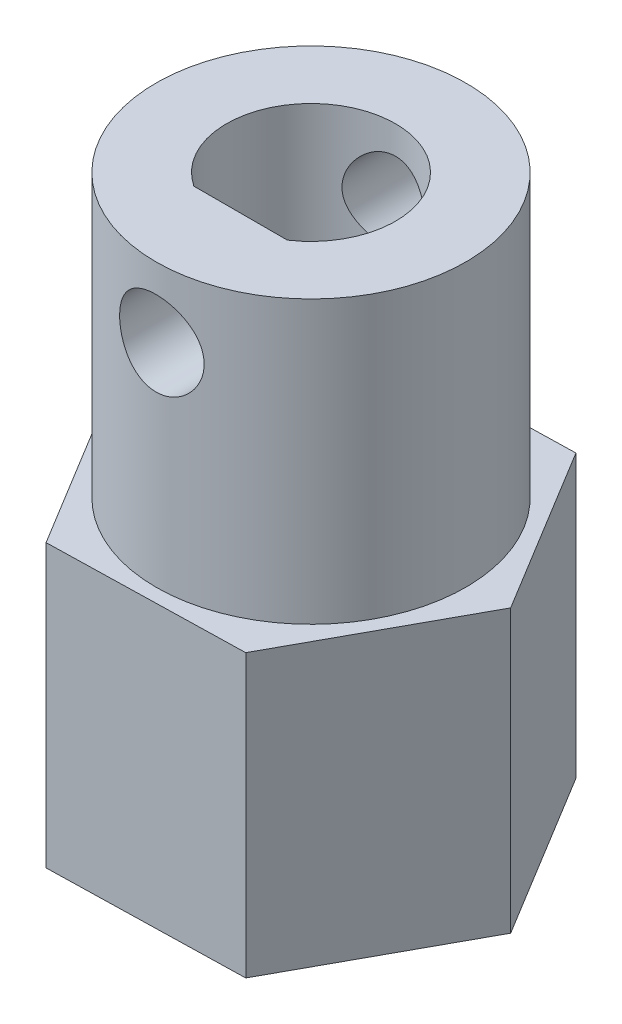
ISO-10303-21;
HEADER;
FILE_DESCRIPTION(('STEP AP214'),'2;1');
FILE_NAME('part.step','',(''),(''),'','','');
FILE_SCHEMA(('AUTOMOTIVE_DESIGN { 1 0 10303 214 1 1 1 1 }'));
ENDSEC;
DATA;
#1=APPLICATION_CONTEXT('core data for automotive mechanical design processes');
#2=APPLICATION_PROTOCOL_DEFINITION('international standard','automotive_design',2000,#1);
#3=PRODUCT_CONTEXT('',#1,'mechanical');
#4=PRODUCT('Part','Part','',(#3));
#5=PRODUCT_RELATED_PRODUCT_CATEGORY('part','',(#4));
#6=PRODUCT_DEFINITION_FORMATION('','',#4);
#7=PRODUCT_DEFINITION_CONTEXT('part definition',#1,'design');
#8=PRODUCT_DEFINITION('design','',#6,#7);
#9=PRODUCT_DEFINITION_SHAPE('','',#8);
#10=(LENGTH_UNIT() NAMED_UNIT(*) SI_UNIT(.MILLI.,.METRE.));
#11=(NAMED_UNIT(*) PLANE_ANGLE_UNIT() SI_UNIT($,.RADIAN.));
#12=(NAMED_UNIT(*) SI_UNIT($,.STERADIAN.) SOLID_ANGLE_UNIT());
#13=UNCERTAINTY_MEASURE_WITH_UNIT(LENGTH_MEASURE(1.E-05),#10,'distance_accuracy_value','');
#14=(GEOMETRIC_REPRESENTATION_CONTEXT(3) GLOBAL_UNCERTAINTY_ASSIGNED_CONTEXT((#13)) GLOBAL_UNIT_ASSIGNED_CONTEXT((#10,
#11,#12)) REPRESENTATION_CONTEXT('',''));
#15=CARTESIAN_POINT('',(0.,0.,0.));
#16=DIRECTION('',(0.,0.,1.));
#17=DIRECTION('',(1.,0.,0.));
#18=AXIS2_PLACEMENT_3D('',#15,#16,#17);
#19=CARTESIAN_POINT('',(-3.32404227515908,10.,6.07871227752681));
#20=DIRECTION('',(-0.0231879868246626,0.,-0.999731122485951));
#21=DIRECTION('',(-0.999731122485951,0.,0.0231879868246626));
#22=AXIS2_PLACEMENT_3D('',#19,#20,#21);
#23=PLANE('',#22);
#24=DIRECTION('',(0.999731122485951,0.,-0.0231879868246626));
#25=VECTOR('',#24,1.);
#26=CARTESIAN_POINT('',(-3.32404227515908,0.,6.07871227752681));
#27=LINE('',#26,#25);
#28=CARTESIAN_POINT('',(-3.32404227515908,0.,6.07871227752681));
#29=VERTEX_POINT('',#28);
#30=CARTESIAN_POINT('',(3.60229811705504,0.,5.9180611923046));
#31=VERTEX_POINT('',#30);
#32=EDGE_CURVE('E143',#29,#31,#27,.T.);
#33=ORIENTED_EDGE('',*,*,#32,.T.);
#34=DIRECTION('',(0.,-1.,0.));
#35=VECTOR('',#34,1.);
#36=CARTESIAN_POINT('',(3.60229811705504,10.,5.9180611923046));
#37=LINE('',#36,#35);
#38=CARTESIAN_POINT('',(3.60229811705504,10.,5.9180611923046));
#39=VERTEX_POINT('',#38);
#40=EDGE_CURVE('E52',#39,#31,#37,.T.);
#41=ORIENTED_EDGE('',*,*,#40,.F.);
#42=DIRECTION('',(0.999731122485951,0.,-0.0231879868246626));
#43=VECTOR('',#42,1.);
#44=CARTESIAN_POINT('',(-3.32404227515908,10.,6.07871227752681));
#45=LINE('',#44,#43);
#46=CARTESIAN_POINT('',(-3.32404227515908,10.,6.07871227752681));
#47=VERTEX_POINT('',#46);
#48=EDGE_CURVE('E155',#47,#39,#45,.T.);
#49=ORIENTED_EDGE('',*,*,#48,.F.);
#50=DIRECTION('',(0.,-1.,0.));
#51=VECTOR('',#50,1.);
#52=CARTESIAN_POINT('',(-3.32404227515908,10.,6.07871227752681));
#53=LINE('',#52,#51);
#54=EDGE_CURVE('E139',#47,#29,#53,.T.);
#55=ORIENTED_EDGE('',*,*,#54,.T.);
#56=EDGE_LOOP('',(#33,#41,#49,#55));
#57=FACE_BOUND('',#56,.T.);
#58=ADVANCED_FACE('F39',(#57),#23,.F.);
#59=CARTESIAN_POINT('',(3.60229811705504,10.,5.9180611923046));
#60=DIRECTION('',(-0.877386542439097,0.,-0.479784175590198));
#61=DIRECTION('',(-0.479784175590198,0.,0.877386542439097));
#62=AXIS2_PLACEMENT_3D('',#59,#60,#61);
#63=PLANE('',#62);
#64=DIRECTION('',(0.479784175590198,0.,-0.877386542439097));
#65=VECTOR('',#64,1.);
#66=CARTESIAN_POINT('',(3.60229811705504,0.,5.9180611923046));
#67=LINE('',#66,#65);
#68=CARTESIAN_POINT('',(6.92634039221413,0.,-0.160651085222219));
#69=VERTEX_POINT('',#68);
#70=EDGE_CURVE('E146',#31,#69,#67,.T.);
#71=ORIENTED_EDGE('',*,*,#70,.T.);
#72=DIRECTION('',(0.,-1.,0.));
#73=VECTOR('',#72,1.);
#74=CARTESIAN_POINT('',(6.92634039221413,10.,-0.160651085222219));
#75=LINE('',#74,#73);
#76=CARTESIAN_POINT('',(6.92634039221413,10.,-0.160651085222219));
#77=VERTEX_POINT('',#76);
#78=EDGE_CURVE('E159',#77,#69,#75,.T.);
#79=ORIENTED_EDGE('',*,*,#78,.F.);
#80=DIRECTION('',(0.479784175590198,0.,-0.877386542439097));
#81=VECTOR('',#80,1.);
#82=CARTESIAN_POINT('',(3.60229811705504,10.,5.9180611923046));
#83=LINE('',#82,#81);
#84=EDGE_CURVE('E105',#39,#77,#83,.T.);
#85=ORIENTED_EDGE('',*,*,#84,.F.);
#86=ORIENTED_EDGE('',*,*,#40,.T.);
#87=EDGE_LOOP('',(#71,#79,#85,#86));
#88=FACE_BOUND('',#87,.T.);
#89=ADVANCED_FACE('F162',(#88),#63,.F.);
#90=CARTESIAN_POINT('',(6.92634039221413,10.,-0.160651085222219));
#91=DIRECTION('',(-0.854198555614434,0.,0.519946946895753));
#92=DIRECTION('',(0.519946946895753,0.,0.854198555614434));
#93=AXIS2_PLACEMENT_3D('',#90,#91,#92);
#94=PLANE('',#93);
#95=DIRECTION('',(-0.519946946895753,0.,-0.854198555614434));
#96=VECTOR('',#95,1.);
#97=CARTESIAN_POINT('',(6.92634039221413,0.,-0.160651085222219));
#98=LINE('',#97,#96);
#99=CARTESIAN_POINT('',(3.32404227515908,0.,-6.07871227752682));
#100=VERTEX_POINT('',#99);
#101=EDGE_CURVE('E149',#69,#100,#98,.T.);
#102=ORIENTED_EDGE('',*,*,#101,.T.);
#103=DIRECTION('',(0.,-1.,0.));
#104=VECTOR('',#103,1.);
#105=CARTESIAN_POINT('',(3.32404227515908,10.,-6.07871227752682));
#106=LINE('',#105,#104);
#107=CARTESIAN_POINT('',(3.32404227515908,10.,-6.07871227752682));
#108=VERTEX_POINT('',#107);
#109=EDGE_CURVE('E134',#108,#100,#106,.T.);
#110=ORIENTED_EDGE('',*,*,#109,.F.);
#111=DIRECTION('',(-0.519946946895753,0.,-0.854198555614434));
#112=VECTOR('',#111,1.);
#113=CARTESIAN_POINT('',(6.92634039221413,10.,-0.160651085222219));
#114=LINE('',#113,#112);
#115=EDGE_CURVE('E122',#77,#108,#114,.T.);
#116=ORIENTED_EDGE('',*,*,#115,.F.);
#117=ORIENTED_EDGE('',*,*,#78,.T.);
#118=EDGE_LOOP('',(#102,#110,#116,#117));
#119=FACE_BOUND('',#118,.T.);
#120=ADVANCED_FACE('F170',(#119),#94,.F.);
#121=CARTESIAN_POINT('',(3.32404227515908,10.,-6.07871227752682));
#122=DIRECTION('',(0.023187986824663,0.,0.999731122485951));
#123=DIRECTION('',(0.999731122485951,0.,-0.023187986824663));
#124=AXIS2_PLACEMENT_3D('',#121,#122,#123);
#125=PLANE('',#124);
#126=DIRECTION('',(-0.999731122485951,0.,0.023187986824663));
#127=VECTOR('',#126,1.);
#128=CARTESIAN_POINT('',(3.32404227515908,0.,-6.07871227752682));
#129=LINE('',#128,#127);
#130=CARTESIAN_POINT('',(-3.60229811705503,0.,-5.9180611923046));
#131=VERTEX_POINT('',#130);
#132=EDGE_CURVE('E131',#100,#131,#129,.T.);
#133=ORIENTED_EDGE('',*,*,#132,.T.);
#134=DIRECTION('',(0.,-1.,0.));
#135=VECTOR('',#134,1.);
#136=CARTESIAN_POINT('',(-3.60229811705503,10.,-5.9180611923046));
#137=LINE('',#136,#135);
#138=CARTESIAN_POINT('',(-3.60229811705503,10.,-5.9180611923046));
#139=VERTEX_POINT('',#138);
#140=EDGE_CURVE('E128',#139,#131,#137,.T.);
#141=ORIENTED_EDGE('',*,*,#140,.F.);
#142=DIRECTION('',(-0.999731122485951,0.,0.023187986824663));
#143=VECTOR('',#142,1.);
#144=CARTESIAN_POINT('',(3.32404227515908,10.,-6.07871227752682));
#145=LINE('',#144,#143);
#146=EDGE_CURVE('E115',#108,#139,#145,.T.);
#147=ORIENTED_EDGE('',*,*,#146,.F.);
#148=ORIENTED_EDGE('',*,*,#109,.T.);
#149=EDGE_LOOP('',(#133,#141,#147,#148));
#150=FACE_BOUND('',#149,.T.);
#151=ADVANCED_FACE('F129',(#150),#125,.F.);
#152=CARTESIAN_POINT('',(-3.60229811705503,10.,-5.9180611923046));
#153=DIRECTION('',(0.877386542439097,0.,0.479784175590199));
#154=DIRECTION('',(0.479784175590199,0.,-0.877386542439097));
#155=AXIS2_PLACEMENT_3D('',#152,#153,#154);
#156=PLANE('',#155);
#157=DIRECTION('',(-0.479784175590199,0.,0.877386542439097));
#158=VECTOR('',#157,1.);
#159=CARTESIAN_POINT('',(-3.60229811705503,0.,-5.9180611923046));
#160=LINE('',#159,#158);
#161=CARTESIAN_POINT('',(-6.92634039221413,0.,0.160651085222216));
#162=VERTEX_POINT('',#161);
#163=EDGE_CURVE('E152',#131,#162,#160,.T.);
#164=ORIENTED_EDGE('',*,*,#163,.T.);
#165=DIRECTION('',(0.,-1.,0.));
#166=VECTOR('',#165,1.);
#167=CARTESIAN_POINT('',(-6.92634039221413,10.,0.160651085222216));
#168=LINE('',#167,#166);
#169=CARTESIAN_POINT('',(-6.92634039221413,10.,0.160651085222216));
#170=VERTEX_POINT('',#169);
#171=EDGE_CURVE('E135',#170,#162,#168,.T.);
#172=ORIENTED_EDGE('',*,*,#171,.F.);
#173=DIRECTION('',(-0.479784175590199,0.,0.877386542439097));
#174=VECTOR('',#173,1.);
#175=CARTESIAN_POINT('',(-3.60229811705503,10.,-5.9180611923046));
#176=LINE('',#175,#174);
#177=EDGE_CURVE('E119',#139,#170,#176,.T.);
#178=ORIENTED_EDGE('',*,*,#177,.F.);
#179=ORIENTED_EDGE('',*,*,#140,.T.);
#180=EDGE_LOOP('',(#164,#172,#178,#179));
#181=FACE_BOUND('',#180,.T.);
#182=ADVANCED_FACE('F137',(#181),#156,.F.);
#183=CARTESIAN_POINT('',(-6.92634039221413,10.,0.160651085222216));
#184=DIRECTION('',(0.854198555614434,0.,-0.519946946895753));
#185=DIRECTION('',(-0.519946946895753,0.,-0.854198555614434));
#186=AXIS2_PLACEMENT_3D('',#183,#184,#185);
#187=PLANE('',#186);
#188=DIRECTION('',(0.519946946895753,0.,0.854198555614434));
#189=VECTOR('',#188,1.);
#190=CARTESIAN_POINT('',(-6.92634039221413,0.,0.160651085222216));
#191=LINE('',#190,#189);
#192=EDGE_CURVE('E96',#162,#29,#191,.T.);
#193=ORIENTED_EDGE('',*,*,#192,.T.);
#194=ORIENTED_EDGE('',*,*,#54,.F.);
#195=DIRECTION('',(0.519946946895753,0.,0.854198555614434));
#196=VECTOR('',#195,1.);
#197=CARTESIAN_POINT('',(-6.92634039221413,10.,0.160651085222216));
#198=LINE('',#197,#196);
#199=EDGE_CURVE('E69',#170,#47,#198,.T.);
#200=ORIENTED_EDGE('',*,*,#199,.F.);
#201=ORIENTED_EDGE('',*,*,#171,.T.);
#202=EDGE_LOOP('',(#193,#194,#200,#201));
#203=FACE_BOUND('',#202,.T.);
#204=ADVANCED_FACE('F249',(#203),#187,.F.);
#205=CARTESIAN_POINT('',(0.,10.,0.));
#206=DIRECTION('',(0.,1.,0.));
#207=DIRECTION('',(0.,0.,1.));
#208=AXIS2_PLACEMENT_3D('',#205,#206,#207);
#209=PLANE('',#208);
#210=CARTESIAN_POINT('',(0.,10.,0.));
#211=DIRECTION('',(0.,1.,0.));
#212=DIRECTION('',(0.,0.,1.));
#213=AXIS2_PLACEMENT_3D('',#210,#211,#212);
#214=CIRCLE('',#213,5.5);
#215=CARTESIAN_POINT('',(0.,10.,5.5));
#216=VERTEX_POINT('',#215);
#217=EDGE_CURVE('E11',#216,#216,#214,.T.);
#218=ORIENTED_EDGE('',*,*,#217,.F.);
#219=EDGE_LOOP('',(#218));
#220=FACE_BOUND('',#219,.T.);
#221=ORIENTED_EDGE('',*,*,#48,.T.);
#222=ORIENTED_EDGE('',*,*,#84,.T.);
#223=ORIENTED_EDGE('',*,*,#115,.T.);
#224=ORIENTED_EDGE('',*,*,#146,.T.);
#225=ORIENTED_EDGE('',*,*,#177,.T.);
#226=ORIENTED_EDGE('',*,*,#199,.T.);
#227=EDGE_LOOP('',(#221,#222,#223,#224,#225,#226));
#228=FACE_BOUND('',#227,.T.);
#229=ADVANCED_FACE('F117',(#220,#228),#209,.T.);
#230=CARTESIAN_POINT('',(0.,0.,0.));
#231=DIRECTION('',(0.,1.,0.));
#232=DIRECTION('',(0.,0.,1.));
#233=AXIS2_PLACEMENT_3D('',#230,#231,#232);
#234=PLANE('',#233);
#235=CARTESIAN_POINT('',(0.,0.,0.));
#236=DIRECTION('',(0.,1.,0.));
#237=DIRECTION('',(0.,0.,1.));
#238=AXIS2_PLACEMENT_3D('',#235,#236,#237);
#239=CIRCLE('',#238,1.5);
#240=CARTESIAN_POINT('',(0.,0.,1.5));
#241=VERTEX_POINT('',#240);
#242=EDGE_CURVE('E357',#241,#241,#239,.T.);
#243=ORIENTED_EDGE('',*,*,#242,.T.);
#244=EDGE_LOOP('',(#243));
#245=FACE_BOUND('',#244,.T.);
#246=ORIENTED_EDGE('',*,*,#32,.F.);
#247=ORIENTED_EDGE('',*,*,#192,.F.);
#248=ORIENTED_EDGE('',*,*,#163,.F.);
#249=ORIENTED_EDGE('',*,*,#132,.F.);
#250=ORIENTED_EDGE('',*,*,#101,.F.);
#251=ORIENTED_EDGE('',*,*,#70,.F.);
#252=EDGE_LOOP('',(#246,#247,#248,#249,#250,#251));
#253=FACE_BOUND('',#252,.T.);
#254=ADVANCED_FACE('F167',(#245,#253),#234,.F.);
#255=CARTESIAN_POINT('',(0.,20.,0.));
#256=DIRECTION('',(0.,-1.,0.));
#257=DIRECTION('',(0.,0.,-1.));
#258=AXIS2_PLACEMENT_3D('',#255,#256,#257);
#259=CYLINDRICAL_SURFACE('',#258,5.5);
#260=CARTESIAN_POINT('',(0.,19.,-5.5));
#261=CARTESIAN_POINT('',(-0.0826209133321936,18.999998187389,-5.49999882717412));
#262=CARTESIAN_POINT('',(-0.165260978812708,18.9931509364166,-5.49812007260761));
#263=CARTESIAN_POINT('',(-0.328155930157698,18.9659941696968,-5.49080798085451));
#264=CARTESIAN_POINT('',(-0.408409727977265,18.9456786083714,-5.48537304740499));
#265=CARTESIAN_POINT('',(-0.564157626055395,18.8922982682616,-5.47154772174135));
#266=CARTESIAN_POINT('',(-0.639657866970163,18.8592503473381,-5.46316123869395));
#267=CARTESIAN_POINT('',(-0.78404449615972,18.7814070673376,-5.44431654412848));
#268=CARTESIAN_POINT('',(-0.852930363289778,18.7366107836461,-5.43385816956517));
#269=CARTESIAN_POINT('',(-0.983796947573262,18.6354001635327,-5.41171397042059));
#270=CARTESIAN_POINT('',(-1.04559512916994,18.5787545591458,-5.4000064149043));
#271=CARTESIAN_POINT('',(-1.15894293682478,18.4559473639701,-5.37682112935063));
#272=CARTESIAN_POINT('',(-1.21049117824722,18.3897844895977,-5.36534343055203));
#273=CARTESIAN_POINT('',(-1.30277794539498,18.2483487524205,-5.34369384163659));
#274=CARTESIAN_POINT('',(-1.34330426837587,18.1729328550637,-5.33354930058623));
#275=CARTESIAN_POINT('',(-1.41102916361228,18.0160361718006,-5.31603507411917));
#276=CARTESIAN_POINT('',(-1.43823031946844,17.9345565651115,-5.30866485085754));
#277=CARTESIAN_POINT('',(-1.47789456441268,17.7698721049875,-5.2977584719274));
#278=CARTESIAN_POINT('',(-1.49068960543229,17.6867530518381,-5.29413612283786));
#279=CARTESIAN_POINT('',(-1.50221364409134,17.5194753169912,-5.29087829084083));
#280=CARTESIAN_POINT('',(-1.50094540140883,17.4353168425,-5.2912420257326));
#281=CARTESIAN_POINT('',(-1.48464191780301,17.2709584490337,-5.29583824875456));
#282=CARTESIAN_POINT('',(-1.47001073668932,17.1907147653978,-5.29995718313671));
#283=CARTESIAN_POINT('',(-1.42804483871807,17.0338667139772,-5.31141755794059));
#284=CARTESIAN_POINT('',(-1.40070906504648,16.9572626495337,-5.31875926644153));
#285=CARTESIAN_POINT('',(-1.3337862982647,16.8088264794525,-5.33593618292326));
#286=CARTESIAN_POINT('',(-1.29405951882948,16.7370607989664,-5.34579959764141));
#287=CARTESIAN_POINT('',(-1.20357988022174,16.6010735525903,-5.36689368797792));
#288=CARTESIAN_POINT('',(-1.15282476106209,16.5368535371613,-5.37812464363249));
#289=CARTESIAN_POINT('',(-1.03967346682896,16.4154748101936,-5.40115894990605));
#290=CARTESIAN_POINT('',(-0.976938646167253,16.3586325507111,-5.41296874297114));
#291=CARTESIAN_POINT('',(-0.842682011788639,16.2562090350222,-5.43548647707978));
#292=CARTESIAN_POINT('',(-0.771159819718557,16.2106282639504,-5.44619437064292));
#293=CARTESIAN_POINT('',(-0.620853953739627,16.1318733272251,-5.46537278121261));
#294=CARTESIAN_POINT('',(-0.542037637417776,16.0987586614161,-5.47383251287305));
#295=CARTESIAN_POINT('',(-0.379672688714392,16.0463420274859,-5.48748356142612));
#296=CARTESIAN_POINT('',(-0.296125144317684,16.0270368975559,-5.49267562644564));
#297=CARTESIAN_POINT('',(-0.129368170483253,16.003289382203,-5.49909228776313));
#298=CARTESIAN_POINT('',(-0.0462242977839818,15.9984170046796,-5.50043163125371));
#299=CARTESIAN_POINT('',(0.119693365637971,16.0024827475134,-5.49932301585136));
#300=CARTESIAN_POINT('',(0.202467195532505,16.0114193696165,-5.49687546782998));
#301=CARTESIAN_POINT('',(0.363745097739554,16.0424975027031,-5.48854239265957));
#302=CARTESIAN_POINT('',(0.442299324272675,16.064397192757,-5.48271986472129));
#303=CARTESIAN_POINT('',(0.594609867448629,16.1204972446405,-5.46829923535645));
#304=CARTESIAN_POINT('',(0.668365651304994,16.1546989696613,-5.45970082634473));
#305=CARTESIAN_POINT('',(0.810641161194588,16.2352164422857,-5.44041573828275));
#306=CARTESIAN_POINT('',(0.879024602412582,16.2817634872615,-5.4296902954988));
#307=CARTESIAN_POINT('',(1.00716022013082,16.3853612875452,-5.40738988410035));
#308=CARTESIAN_POINT('',(1.06691060617763,16.4424142161575,-5.39581474001048));
#309=CARTESIAN_POINT('',(1.17791060344312,16.5674140380349,-5.37269401558495));
#310=CARTESIAN_POINT('',(1.22885627747222,16.635633382279,-5.36115944983886));
#311=CARTESIAN_POINT('',(1.3185858220796,16.7798986472193,-5.33980026187814));
#312=CARTESIAN_POINT('',(1.35737017925923,16.8559442546075,-5.32997557125461));
#313=CARTESIAN_POINT('',(1.42138558317209,17.013340628242,-5.31326248703816));
#314=CARTESIAN_POINT('',(1.44669352306985,17.0946582605252,-5.30635748202252));
#315=CARTESIAN_POINT('',(1.48320917220691,17.2606168380276,-5.29626814696188));
#316=CARTESIAN_POINT('',(1.49442068863148,17.3452568795537,-5.29308281231876));
#317=CARTESIAN_POINT('',(1.50219895576908,17.5123384038175,-5.29088009671763));
#318=CARTESIAN_POINT('',(1.49925533217026,17.5947555887225,-5.29172336001588));
#319=CARTESIAN_POINT('',(1.47994837643976,17.757870647735,-5.29715501736986));
#320=CARTESIAN_POINT('',(1.46358542028567,17.838568569947,-5.30174330649891));
#321=CARTESIAN_POINT('',(1.41819408435119,17.9953063157761,-5.31406316491799));
#322=CARTESIAN_POINT('',(1.38927395449127,18.0713797532418,-5.32176783125817));
#323=CARTESIAN_POINT('',(1.31967304541386,18.2176532768133,-5.33945189987964));
#324=CARTESIAN_POINT('',(1.27899034504456,18.2878524010652,-5.34943167369227));
#325=CARTESIAN_POINT('',(1.18555430984851,18.4227105976926,-5.37092379381814));
#326=CARTESIAN_POINT('',(1.13246901822125,18.4871337048431,-5.38247375845259));
#327=CARTESIAN_POINT('',(1.01636011199274,18.6063164067946,-5.40559990490855));
#328=CARTESIAN_POINT('',(0.953334059387993,18.6610736240053,-5.41717609247304));
#329=CARTESIAN_POINT('',(0.817407725686076,18.7605946145194,-5.43936459177359));
#330=CARTESIAN_POINT('',(0.744315866262517,18.805103480867,-5.44994907753807));
#331=CARTESIAN_POINT('',(0.591399899839277,18.8811324362115,-5.46865263780403));
#332=CARTESIAN_POINT('',(0.511579952421219,18.9126604805543,-5.47677322151197));
#333=CARTESIAN_POINT('',(0.36010010121821,18.957939509979,-5.48864193995757));
#334=CARTESIAN_POINT('',(0.289064640262467,18.9736745512417,-5.49286947681091));
#335=CARTESIAN_POINT('',(0.145357607941484,18.9947050253188,-5.49854887164354));
#336=CARTESIAN_POINT('',(0.0726862155649467,19.0000015946548,-5.5000010318002));
#337=CARTESIAN_POINT('',(0.,19.,-5.5));
#338=B_SPLINE_CURVE_WITH_KNOTS('',3,(#260,#261,#262,#263,#264,#265,#266,#267,#268,#269,#270,
#271,#272,#273,#274,#275,#276,#277,#278,#279,#280,#281,#282,#283,#284,#285,#286,#287,#288,#289,
#290,#291,#292,#293,#294,#295,#296,#297,#298,#299,#300,#301,#302,#303,#304,#305,#306,#307,#308,
#309,#310,#311,#312,#313,#314,#315,#316,#317,#318,#319,#320,#321,#322,#323,#324,#325,#326,#327,
#328,#329,#330,#331,#332,#333,#334,#335,#336,#337),.UNSPECIFIED.,.T.,.F.,(4,2,2,2,2,2,2,2,2,2,2,
2,2,2,2,2,2,2,2,2,2,2,2,2,2,2,2,2,2,2,2,2,2,2,2,2,2,2,4),(0.,0.247596106854897,0.4953034285513,
0.74268390242058,0.990083851364705,1.24285878223179,1.49566783659324,1.7530459365022,
2.01037411390997,2.26164304860926,2.51286267696538,2.75672886674887,3.00061534583717,
3.24735926767928,3.49415380139121,3.74938528550775,4.00462776284424,4.26107349736029,
4.51746049766944,4.76612811343083,5.01476875105251,5.25891111200195,5.50308053475837,
5.75219469009681,6.00136043656003,6.2579007306487,6.51443075867912,6.76948096455405,
7.02446227124211,7.27068852228629,7.51690787489588,7.76104555655818,8.00522313517587,
8.25689011392092,8.50861891104975,8.7660587228906,9.02334052607437,9.2411883209319,
9.45901239561305),.UNSPECIFIED.);
#339=CARTESIAN_POINT('',(0.,19.,-5.5));
#340=VERTEX_POINT('',#339);
#341=EDGE_CURVE('E186',#340,#340,#338,.T.);
#342=ORIENTED_EDGE('',*,*,#341,.T.);
#343=EDGE_LOOP('',(#342));
#344=FACE_BOUND('',#343,.T.);
#345=CARTESIAN_POINT('',(-1.5,17.5,5.29150262212918));
#346=CARTESIAN_POINT('',(-1.4999981569703,17.5825564510277,5.29150397933242));
#347=CARTESIAN_POINT('',(-1.49316121586719,17.6651321099555,5.29345578048323));
#348=CARTESIAN_POINT('',(-1.46604910592423,17.8278935253,5.3010274190552));
#349=CARTESIAN_POINT('',(-1.44576759691971,17.9080781354985,5.30664898703923));
#350=CARTESIAN_POINT('',(-1.39248674622751,18.0636791879618,5.32087717395131));
#351=CARTESIAN_POINT('',(-1.35950584697685,18.1391023609042,5.32947946238205));
#352=CARTESIAN_POINT('',(-1.2818207402325,18.2833581342367,5.34869425130277));
#353=CARTESIAN_POINT('',(-1.23711546969878,18.3521901362373,5.35930693404948));
#354=CARTESIAN_POINT('',(-1.13599985857016,18.4831102067913,5.38165786345274));
#355=CARTESIAN_POINT('',(-1.07933774218464,18.545000328378,5.39341679089298));
#356=CARTESIAN_POINT('',(-0.956458027204656,18.6585276577255,5.41655710292429));
#357=CARTESIAN_POINT('',(-0.890239400501259,18.710163760916,5.4279384467319));
#358=CARTESIAN_POINT('',(-0.748747592415017,18.8025486268105,5.44927272086847));
#359=CARTESIAN_POINT('',(-0.673340883118103,18.8430997218264,5.45919841481043));
#360=CARTESIAN_POINT('',(-0.516463712056495,18.9108728681829,5.4762652255866));
#361=CARTESIAN_POINT('',(-0.434994324603006,18.9380972745742,5.48340683437022));
#362=CARTESIAN_POINT('',(-0.270371451848028,18.9778010982805,5.49395456075485));
#363=CARTESIAN_POINT('',(-0.187304783419296,18.9906174442147,5.4974458959785));
#364=CARTESIAN_POINT('',(-0.0201318714747533,19.002202302298,5.50059802264474));
#365=CARTESIAN_POINT('',(0.063974187790725,19.0009732695445,5.50025948354));
#366=CARTESIAN_POINT('',(0.228490060702581,18.9847376013516,5.49585206403333));
#367=CARTESIAN_POINT('',(0.308938859429582,18.9700951266807,5.49188178563756));
#368=CARTESIAN_POINT('',(0.466191004896708,18.9280376676544,5.48077394096948));
#369=CARTESIAN_POINT('',(0.542994138822173,18.9006219386717,5.47363619004791));
#370=CARTESIAN_POINT('',(0.691693236894893,18.833522864157,5.45685088879515));
#371=CARTESIAN_POINT('',(0.763530775491581,18.7937165513123,5.44717834180867));
#372=CARTESIAN_POINT('',(0.899629268660998,18.7030611057326,5.4263628785745));
#373=CARTESIAN_POINT('',(0.963888684077532,18.6522097356287,5.41521966459727));
#374=CARTESIAN_POINT('',(1.08518074875882,18.5389820048791,5.39224620796906));
#375=CARTESIAN_POINT('',(1.14191553261874,18.4762883280592,5.38040539296798));
#376=CARTESIAN_POINT('',(1.24414076282169,18.3421547848867,5.35769198772825));
#377=CARTESIAN_POINT('',(1.28963045681795,18.2707143338136,5.34681946230361));
#378=CARTESIAN_POINT('',(1.36831504906637,18.1204456059996,5.32722971617593));
#379=CARTESIAN_POINT('',(1.40142544272701,18.0415709942258,5.31852743967169));
#380=CARTESIAN_POINT('',(1.45381649809065,17.8790773977709,5.30444735453973));
#381=CARTESIAN_POINT('',(1.47310077178258,17.7954596583672,5.29906867769277));
#382=CARTESIAN_POINT('',(1.49677126460125,17.62864781849,5.29243075183376));
#383=CARTESIAN_POINT('',(1.50160329063472,17.5455218132359,5.29104827888985));
#384=CARTESIAN_POINT('',(1.49746332611022,17.3796488564579,5.29222151202243));
#385=CARTESIAN_POINT('',(1.48849288189024,17.2969018635137,5.29477677694071));
#386=CARTESIAN_POINT('',(1.45739637961776,17.1358775626886,5.30341820279288));
#387=CARTESIAN_POINT('',(1.43554156609381,17.0575435793702,5.3094315020934));
#388=CARTESIAN_POINT('',(1.37960331838531,16.9056539900694,5.32423951436502));
#389=CARTESIAN_POINT('',(1.34551823366714,16.8320990306223,5.33303460273288));
#390=CARTESIAN_POINT('',(1.26519240779034,16.689999291833,5.3526656797527));
#391=CARTESIAN_POINT('',(1.21869167395158,16.621607425495,5.36354371589181));
#392=CARTESIAN_POINT('',(1.11517441622706,16.4934339346149,5.3860176273416));
#393=CARTESIAN_POINT('',(1.05815582137422,16.4336540098999,5.39761364372337));
#394=CARTESIAN_POINT('',(0.933153363001189,16.3225336360494,5.42064365021152));
#395=CARTESIAN_POINT('',(0.864888847519602,16.2715049965658,5.43206199790196));
#396=CARTESIAN_POINT('',(0.720505557506889,16.181629364909,5.45308956662174));
#397=CARTESIAN_POINT('',(0.6443872011088,16.1427817246722,5.46269888388575));
#398=CARTESIAN_POINT('',(0.486992338151914,16.0787329337421,5.47896373225224));
#399=CARTESIAN_POINT('',(0.405760013245428,16.0534291096995,5.48564141597945));
#400=CARTESIAN_POINT('',(0.239985864722823,16.0168930474549,5.49538823820121));
#401=CARTESIAN_POINT('',(0.155444815623821,16.0056575361731,5.4984582160406));
#402=CARTESIAN_POINT('',(-0.0116397196820183,15.9977898799094,5.50060207356917));
#403=CARTESIAN_POINT('',(-0.0941604093051871,16.0007013286933,5.49980084994582));
#404=CARTESIAN_POINT('',(-0.257491304637161,16.01997977731,5.4945768528746));
#405=CARTESIAN_POINT('',(-0.338301579771113,16.0363462299303,5.49015422670854));
#406=CARTESIAN_POINT('',(-0.495342033696845,16.0818073703395,5.47821112917835));
#407=CARTESIAN_POINT('',(-0.571602011794988,16.1108056982402,5.47071413494114));
#408=CARTESIAN_POINT('',(-0.718217369622532,16.1806216215351,5.45340440920124));
#409=CARTESIAN_POINT('',(-0.788571890732092,16.2214409318066,5.44359134174257));
#410=CARTESIAN_POINT('',(-0.92348867519543,16.3150547282817,5.42235787347661));
#411=CARTESIAN_POINT('',(-0.987837043212874,16.3681490724366,5.41090053751388));
#412=CARTESIAN_POINT('',(-1.10686496193089,16.4842421385502,5.38781343748961));
#413=CARTESIAN_POINT('',(-1.16154192474211,16.5472435029513,5.37618362817694));
#414=CARTESIAN_POINT('',(-1.2609396606189,16.6831275268309,5.35375507792812));
#415=CARTESIAN_POINT('',(-1.30539879787934,16.7562062026808,5.34298201162846));
#416=CARTESIAN_POINT('',(-1.38133806303029,16.9090859451496,5.32385655741428));
#417=CARTESIAN_POINT('',(-1.41282630671052,16.9888827705103,5.31550265682104));
#418=CARTESIAN_POINT('',(-1.45802611152119,17.1402680192526,5.30326481572331));
#419=CARTESIAN_POINT('',(-1.47372831222931,17.2112284687515,5.29889066810921));
#420=CARTESIAN_POINT('',(-1.494715407894,17.3547877979027,5.29300915582115));
#421=CARTESIAN_POINT('',(-1.5000016210592,17.4273864690513,5.29150142838456));
#422=CARTESIAN_POINT('',(-1.5,17.5,5.29150262212918));
#423=B_SPLINE_CURVE_WITH_KNOTS('',3,(#345,#346,#347,#348,#349,#350,#351,#352,#353,#354,#355,
#356,#357,#358,#359,#360,#361,#362,#363,#364,#365,#366,#367,#368,#369,#370,#371,#372,#373,#374,
#375,#376,#377,#378,#379,#380,#381,#382,#383,#384,#385,#386,#387,#388,#389,#390,#391,#392,#393,
#394,#395,#396,#397,#398,#399,#400,#401,#402,#403,#404,#405,#406,#407,#408,#409,#410,#411,#412,
#413,#414,#415,#416,#417,#418,#419,#420,#421,#422),.UNSPECIFIED.,.T.,.F.,(4,2,2,2,2,2,2,2,2,2,2,
2,2,2,2,2,2,2,2,2,2,2,2,2,2,2,2,2,2,2,2,2,2,2,2,2,2,2,4),(0.,0.247402201391969,0.49492115533674,
0.742082002291412,0.989265266888851,1.24229327000825,1.49534851471803,1.75265882819585,
2.00992365416646,2.26103843021061,2.51210931268384,2.75655962385663,3.0010241872433,
3.24799669713117,3.49501928234234,3.74996416866223,4.00492610732058,4.26159801830625,
4.51820285087414,4.76680611540842,5.01538153009581,5.25890187447337,5.50245509545498,
5.75157425489228,6.00074251835821,6.25748556676549,6.51421495339717,6.76896951768223,
7.02366480072505,7.27019876040454,7.51672269408902,7.76139812559489,8.00610907011738,
8.25758505394755,8.50912822664454,8.76653181226182,9.02377409687475,9.24140725781327,
9.45901287413893),.UNSPECIFIED.);
#424=CARTESIAN_POINT('',(-1.5,17.5,5.29150262212918));
#425=VERTEX_POINT('',#424);
#426=EDGE_CURVE('E197',#425,#425,#423,.T.);
#427=ORIENTED_EDGE('',*,*,#426,.T.);
#428=EDGE_LOOP('',(#427));
#429=FACE_BOUND('',#428,.T.);
#430=CARTESIAN_POINT('',(0.,20.,0.));
#431=DIRECTION('',(0.,1.,0.));
#432=DIRECTION('',(0.,0.,1.));
#433=AXIS2_PLACEMENT_3D('',#430,#431,#432);
#434=CIRCLE('',#433,5.5);
#435=CARTESIAN_POINT('',(0.,20.,5.5));
#436=VERTEX_POINT('',#435);
#437=EDGE_CURVE('E147',#436,#436,#434,.T.);
#438=ORIENTED_EDGE('',*,*,#437,.F.);
#439=EDGE_LOOP('',(#438));
#440=FACE_BOUND('',#439,.T.);
#441=ORIENTED_EDGE('',*,*,#217,.T.);
#442=EDGE_LOOP('',(#441));
#443=FACE_BOUND('',#442,.T.);
#444=ADVANCED_FACE('F202',(#344,#429,#440,#443),#259,.T.);
#445=CARTESIAN_POINT('',(0.,20.,0.));
#446=DIRECTION('',(0.,1.,0.));
#447=DIRECTION('',(0.,0.,1.));
#448=AXIS2_PLACEMENT_3D('',#445,#446,#447);
#449=PLANE('',#448);
#450=DIRECTION('',(1.,0.,0.));
#451=VECTOR('',#450,1.);
#452=CARTESIAN_POINT('',(0.,20.,2.5));
#453=LINE('',#452,#451);
#454=CARTESIAN_POINT('',(-1.6583123951777,20.,2.5));
#455=VERTEX_POINT('',#454);
#456=CARTESIAN_POINT('',(1.6583123951777,20.,2.5));
#457=VERTEX_POINT('',#456);
#458=EDGE_CURVE('E60',#455,#457,#453,.T.);
#459=ORIENTED_EDGE('',*,*,#458,.F.);
#460=CARTESIAN_POINT('',(0.,20.,0.));
#461=DIRECTION('',(0.,1.,0.));
#462=DIRECTION('',(0.,0.,1.));
#463=AXIS2_PLACEMENT_3D('',#460,#461,#462);
#464=CIRCLE('',#463,3.);
#465=EDGE_CURVE('E181',#457,#455,#464,.T.);
#466=ORIENTED_EDGE('',*,*,#465,.F.);
#467=EDGE_LOOP('',(#459,#466));
#468=FACE_BOUND('',#467,.T.);
#469=ORIENTED_EDGE('',*,*,#437,.T.);
#470=EDGE_LOOP('',(#469));
#471=FACE_BOUND('',#470,.T.);
#472=ADVANCED_FACE('F226',(#468,#471),#449,.T.);
#473=CARTESIAN_POINT('',(0.,8.5,2.5));
#474=DIRECTION('',(0.,0.,1.));
#475=DIRECTION('',(1.,0.,0.));
#476=AXIS2_PLACEMENT_3D('',#473,#474,#475);
#477=PLANE('',#476);
#478=CARTESIAN_POINT('',(0.,17.5,2.5));
#479=DIRECTION('',(0.,0.,1.));
#480=DIRECTION('',(1.,0.,0.));
#481=AXIS2_PLACEMENT_3D('',#478,#479,#480);
#482=CIRCLE('',#481,1.5);
#483=CARTESIAN_POINT('',(1.5,17.5,2.5));
#484=VERTEX_POINT('',#483);
#485=EDGE_CURVE('E363',#484,#484,#482,.T.);
#486=ORIENTED_EDGE('',*,*,#485,.T.);
#487=EDGE_LOOP('',(#486));
#488=FACE_BOUND('',#487,.T.);
#489=ORIENTED_EDGE('',*,*,#458,.T.);
#490=DIRECTION('',(0.,1.,0.));
#491=VECTOR('',#490,1.);
#492=CARTESIAN_POINT('',(1.6583123951777,8.5,2.5));
#493=LINE('',#492,#491);
#494=CARTESIAN_POINT('',(1.6583123951777,8.5,2.5));
#495=VERTEX_POINT('',#494);
#496=EDGE_CURVE('E177',#495,#457,#493,.T.);
#497=ORIENTED_EDGE('',*,*,#496,.F.);
#498=DIRECTION('',(1.,0.,0.));
#499=VECTOR('',#498,1.);
#500=CARTESIAN_POINT('',(0.,8.5,2.5));
#501=LINE('',#500,#499);
#502=CARTESIAN_POINT('',(-1.6583123951777,8.5,2.5));
#503=VERTEX_POINT('',#502);
#504=EDGE_CURVE('E184',#503,#495,#501,.T.);
#505=ORIENTED_EDGE('',*,*,#504,.F.);
#506=DIRECTION('',(0.,1.,0.));
#507=VECTOR('',#506,1.);
#508=CARTESIAN_POINT('',(-1.6583123951777,8.5,2.5));
#509=LINE('',#508,#507);
#510=EDGE_CURVE('E176',#503,#455,#509,.T.);
#511=ORIENTED_EDGE('',*,*,#510,.T.);
#512=EDGE_LOOP('',(#489,#497,#505,#511));
#513=FACE_BOUND('',#512,.T.);
#514=ADVANCED_FACE('F223',(#488,#513),#477,.F.);
#515=CARTESIAN_POINT('',(0.,8.5,0.));
#516=DIRECTION('',(0.,1.,0.));
#517=DIRECTION('',(0.,0.,1.));
#518=AXIS2_PLACEMENT_3D('',#515,#516,#517);
#519=CYLINDRICAL_SURFACE('',#518,3.);
#520=CARTESIAN_POINT('',(-1.5,17.5,-2.59807621135332));
#521=CARTESIAN_POINT('',(-1.4999945446118,17.5781617122929,-2.59808302092689));
#522=CARTESIAN_POINT('',(-1.49384995609983,17.6564221172876,-2.60165701781635));
#523=CARTESIAN_POINT('',(-1.46958481484708,17.8105408970157,-2.61543549678079));
#524=CARTESIAN_POINT('',(-1.45143909683127,17.8863938725651,-2.62565391083339));
#525=CARTESIAN_POINT('',(-1.40414992304972,18.0331774965159,-2.65124019908098));
#526=CARTESIAN_POINT('',(-1.3750649287406,18.1041319787104,-2.66658065209878));
#527=CARTESIAN_POINT('',(-1.30690128806456,18.2401363029951,-2.70063997225287));
#528=CARTESIAN_POINT('',(-1.26782210105366,18.3051858253937,-2.71935902214097));
#529=CARTESIAN_POINT('',(-1.17699981079632,18.4334585928363,-2.75995303586162));
#530=CARTESIAN_POINT('',(-1.12447805421566,18.4960887035103,-2.7819609545693));
#531=CARTESIAN_POINT('',(-1.00988071142171,18.6121125826101,-2.82557974178558));
#532=CARTESIAN_POINT('',(-0.947800388673444,18.6655017438753,-2.84719040746875));
#533=CARTESIAN_POINT('',(-0.810734345121823,18.7650507267215,-2.88932215429424));
#534=CARTESIAN_POINT('',(-0.735160783518866,18.8104806517893,-2.90967159627259));
#535=CARTESIAN_POINT('',(-0.576235539899259,18.8877112798686,-2.94526134149293));
#536=CARTESIAN_POINT('',(-0.492888807207236,18.9195205842058,-2.96050486775612));
#537=CARTESIAN_POINT('',(-0.327067415888968,18.9662569919516,-2.98320691866356));
#538=CARTESIAN_POINT('',(-0.244952685733228,18.9822242895333,-2.99114220331338));
#539=CARTESIAN_POINT('',(-0.0788559430467733,19.0002491780126,-3.00011375769101));
#540=CARTESIAN_POINT('',(0.00512490876560713,19.0023151851936,-3.00115420176885));
#541=CARTESIAN_POINT('',(0.164748786635625,18.9928799890445,-2.99644472874675));
#542=CARTESIAN_POINT('',(0.240481798765187,18.9825429767182,-2.99127743838241));
#543=CARTESIAN_POINT('',(0.388970657877483,18.950678734143,-2.97561367889621));
#544=CARTESIAN_POINT('',(0.461726281640888,18.9291506665357,-2.96511681099591));
#545=CARTESIAN_POINT('',(0.60346408735433,18.8753761508653,-2.93957374931482));
#546=CARTESIAN_POINT('',(0.672380135272767,18.8429855302419,-2.92446662293799));
#547=CARTESIAN_POINT('',(0.803965202269992,18.7686048756978,-2.89106468980031));
#548=CARTESIAN_POINT('',(0.866631973257968,18.7266114050465,-2.87276874236226));
#549=CARTESIAN_POINT('',(0.990260491347292,18.6296569727005,-2.83266591598844));
#550=CARTESIAN_POINT('',(1.05050111254404,18.573845457511,-2.81069063997263));
#551=CARTESIAN_POINT('',(1.16115655544667,18.4531154126047,-2.76681510880218));
#552=CARTESIAN_POINT('',(1.21156381736135,18.3881899415889,-2.74491492398443));
#553=CARTESIAN_POINT('',(1.30425800196332,18.2460277113639,-2.70216234138727));
#554=CARTESIAN_POINT('',(1.34582597246708,18.1682709654187,-2.68146479986061));
#555=CARTESIAN_POINT('',(1.41497866950185,18.0055934929615,-2.64563175417864));
#556=CARTESIAN_POINT('',(1.44257798731633,17.9206803504737,-2.63049045069101));
#557=CARTESIAN_POINT('',(1.48077031653756,17.7531782330758,-2.60916953725552));
#558=CARTESIAN_POINT('',(1.49253768317996,17.6709383214347,-2.60237483772745));
#559=CARTESIAN_POINT('',(1.50227541991714,17.5053979877252,-2.59676879042414));
#560=CARTESIAN_POINT('',(1.50025553597254,17.4220983563203,-2.59795180333967));
#561=CARTESIAN_POINT('',(1.48355406501595,17.2665191221319,-2.60751504810877));
#562=CARTESIAN_POINT('',(1.4702817250687,17.1940308233381,-2.61509381259981));
#563=CARTESIAN_POINT('',(1.43354442694866,17.0524483205936,-2.63541032327012));
#564=CARTESIAN_POINT('',(1.41007616793542,16.9833552238801,-2.64814974007551));
#565=CARTESIAN_POINT('',(1.35247138290733,16.846883003646,-2.67804333119485));
#566=CARTESIAN_POINT('',(1.31789109553909,16.7797314747197,-2.69537464864595));
#567=CARTESIAN_POINT('',(1.23943059602371,16.6517960926915,-2.73234179245875));
#568=CARTESIAN_POINT('',(1.19554560649832,16.5910155347301,-2.75197880032721));
#569=CARTESIAN_POINT('',(1.09325575079828,16.4695318487147,-2.79431997684504));
#570=CARTESIAN_POINT('',(1.03371790847245,16.4098042739235,-2.81709874731434));
#571=CARTESIAN_POINT('',(0.905106743097434,16.3008816430096,-2.86101352466839));
#572=CARTESIAN_POINT('',(0.836030211983022,16.2516901446542,-2.88214897511564));
#573=CARTESIAN_POINT('',(0.687803043838137,16.1641394110748,-2.92112042536435));
#574=CARTESIAN_POINT('',(0.60843464636117,16.1261003226836,-2.93885462508044));
#575=CARTESIAN_POINT('',(0.443283546961623,16.0642931442139,-2.96825032438951));
#576=CARTESIAN_POINT('',(0.357506552088264,16.0405125229505,-2.9799171551456));
#577=CARTESIAN_POINT('',(0.190469523495626,16.009947153738,-2.99501262272824));
#578=CARTESIAN_POINT('',(0.109517165775686,16.0018031861858,-2.99909891862287));
#579=CARTESIAN_POINT('',(-0.0526889789268048,15.9987351018184,-3.00063195562697));
#580=CARTESIAN_POINT('',(-0.13394265044263,16.0038063572147,-2.99808102100335));
#581=CARTESIAN_POINT('',(-0.288806988475721,16.0261246101934,-2.98700953256884));
#582=CARTESIAN_POINT('',(-0.362568476716896,16.0425472738865,-2.97889342001985));
#583=CARTESIAN_POINT('',(-0.506168928275426,16.0859904989545,-2.95788140495135));
#584=CARTESIAN_POINT('',(-0.576007327433263,16.1130125801402,-2.94498481699194));
#585=CARTESIAN_POINT('',(-0.713135109367327,16.178090578249,-2.9148889612218));
#586=CARTESIAN_POINT('',(-0.780187714050069,16.2165689848118,-2.89752925798199));
#587=CARTESIAN_POINT('',(-0.907161962721037,16.3029368962886,-2.86032199712739));
#588=CARTESIAN_POINT('',(-0.967080311122361,16.3508307236735,-2.84047329837541));
#589=CARTESIAN_POINT('',(-1.08437100623534,16.4601957085341,-2.79792915339941));
#590=CARTESIAN_POINT('',(-1.14089652680891,16.5225437312158,-2.77514698517547));
#591=CARTESIAN_POINT('',(-1.24299493109201,16.6561760816947,-2.73094614244278));
#592=CARTESIAN_POINT('',(-1.28855812501509,16.7274682313015,-2.70952868642798));
#593=CARTESIAN_POINT('',(-1.36864661967848,16.8799549698714,-2.66999407957374));
#594=CARTESIAN_POINT('',(-1.40277759894141,16.9613912966931,-2.65200261384405));
#595=CARTESIAN_POINT('',(-1.45631806425962,17.1299986065097,-2.62299234492527));
#596=CARTESIAN_POINT('',(-1.47577678676302,17.217149333369,-2.61195024221553));
#597=CARTESIAN_POINT('',(-1.49155051179662,17.337708033478,-2.60293908902686));
#598=CARTESIAN_POINT('',(-1.49471415744578,17.3700518415968,-2.60112193507728));
#599=CARTESIAN_POINT('',(-1.49894010763495,17.4349247210234,-2.59868903831625));
#600=CARTESIAN_POINT('',(-1.50000227159981,17.4674538045788,-2.59807337587664));
#601=CARTESIAN_POINT('',(-1.5,17.5,-2.59807621135332));
#602=B_SPLINE_CURVE_WITH_KNOTS('',3,(#520,#521,#522,#523,#524,#525,#526,#527,#528,#529,#530,
#531,#532,#533,#534,#535,#536,#537,#538,#539,#540,#541,#542,#543,#544,#545,#546,#547,#548,#549,
#550,#551,#552,#553,#554,#555,#556,#557,#558,#559,#560,#561,#562,#563,#564,#565,#566,#567,#568,
#569,#570,#571,#572,#573,#574,#575,#576,#577,#578,#579,#580,#581,#582,#583,#584,#585,#586,#587,
#588,#589,#590,#591,#592,#593,#594,#595,#596,#597,#598,#599,#600,#601),.UNSPECIFIED.,.T.,.F.,(4,
2,2,2,2,2,2,2,2,2,2,2,2,2,2,2,2,2,2,2,2,2,2,2,2,2,2,2,2,2,2,2,2,2,2,2,2,2,2,2,4),(0.,
0.234348183892075,0.469189339237207,0.702792893878327,0.936409088167723,1.18929346874735,
1.44230356626556,1.71236838358145,1.98226240445836,2.23295227451903,2.4834903552906,
2.71224146226808,2.94100968776183,3.1729430209672,3.40495949025408,3.65890787185336,
3.91305072368878,4.18333262594173,4.45333161317558,4.70193436281317,4.95036139782559,
5.17161275136038,5.39293578654094,5.62450944609132,5.85620229330071,6.1171011537092,
6.37808797467303,6.64596272119449,6.91360169713157,7.1566840558423,7.39968130190957,
7.62666637307239,7.85368400268019,8.09041126079208,8.32724745151079,8.58765362775101,
8.84828914267731,9.11716123557908,9.38512699504141,9.48270202777965,9.58028358741811),.UNSPECIFIED.);
#603=CARTESIAN_POINT('',(-1.5,17.5,-2.59807621135332));
#604=VERTEX_POINT('',#603);
#605=EDGE_CURVE('E42',#604,#604,#602,.T.);
#606=ORIENTED_EDGE('',*,*,#605,.T.);
#607=EDGE_LOOP('',(#606));
#608=FACE_BOUND('',#607,.T.);
#609=ORIENTED_EDGE('',*,*,#465,.T.);
#610=ORIENTED_EDGE('',*,*,#510,.F.);
#611=CARTESIAN_POINT('',(0.,8.5,0.));
#612=DIRECTION('',(0.,1.,0.));
#613=DIRECTION('',(0.,0.,1.));
#614=AXIS2_PLACEMENT_3D('',#611,#612,#613);
#615=CIRCLE('',#614,3.);
#616=EDGE_CURVE('E179',#495,#503,#615,.T.);
#617=ORIENTED_EDGE('',*,*,#616,.F.);
#618=ORIENTED_EDGE('',*,*,#496,.T.);
#619=EDGE_LOOP('',(#609,#610,#617,#618));
#620=FACE_BOUND('',#619,.T.);
#621=ADVANCED_FACE('F218',(#608,#620),#519,.F.);
#622=CARTESIAN_POINT('',(0.,8.5,0.));
#623=DIRECTION('',(0.,1.,0.));
#624=DIRECTION('',(0.,0.,1.));
#625=AXIS2_PLACEMENT_3D('',#622,#623,#624);
#626=PLANE('',#625);
#627=CARTESIAN_POINT('',(0.,8.5,0.));
#628=DIRECTION('',(0.,1.,0.));
#629=DIRECTION('',(0.,0.,1.));
#630=AXIS2_PLACEMENT_3D('',#627,#628,#629);
#631=CIRCLE('',#630,1.5);
#632=CARTESIAN_POINT('',(0.,8.5,1.5));
#633=VERTEX_POINT('',#632);
#634=EDGE_CURVE('E360',#633,#633,#631,.T.);
#635=ORIENTED_EDGE('',*,*,#634,.F.);
#636=EDGE_LOOP('',(#635));
#637=FACE_BOUND('',#636,.T.);
#638=ORIENTED_EDGE('',*,*,#504,.T.);
#639=ORIENTED_EDGE('',*,*,#616,.T.);
#640=EDGE_LOOP('',(#638,#639));
#641=FACE_BOUND('',#640,.T.);
#642=ADVANCED_FACE('F212',(#637,#641),#626,.T.);
#643=CARTESIAN_POINT('',(0.,17.5,6.07871227752681));
#644=DIRECTION('',(0.,0.,-1.));
#645=DIRECTION('',(-1.,0.,0.));
#646=AXIS2_PLACEMENT_3D('',#643,#644,#645);
#647=CYLINDRICAL_SURFACE('',#646,1.5);
#648=ORIENTED_EDGE('',*,*,#605,.F.);
#649=EDGE_LOOP('',(#648));
#650=FACE_BOUND('',#649,.T.);
#651=ORIENTED_EDGE('',*,*,#341,.F.);
#652=EDGE_LOOP('',(#651));
#653=FACE_BOUND('',#652,.T.);
#654=ADVANCED_FACE('F206',(#650,#653),#647,.F.);
#655=ORIENTED_EDGE('',*,*,#485,.F.);
#656=EDGE_LOOP('',(#655));
#657=FACE_BOUND('',#656,.T.);
#658=ORIENTED_EDGE('',*,*,#426,.F.);
#659=EDGE_LOOP('',(#658));
#660=FACE_BOUND('',#659,.T.);
#661=ADVANCED_FACE('F211',(#657,#660),#647,.F.);
#662=CARTESIAN_POINT('',(0.,0.,0.));
#663=DIRECTION('',(0.,1.,0.));
#664=DIRECTION('',(0.,0.,1.));
#665=AXIS2_PLACEMENT_3D('',#662,#663,#664);
#666=CYLINDRICAL_SURFACE('',#665,1.5);
#667=ORIENTED_EDGE('',*,*,#242,.F.);
#668=EDGE_LOOP('',(#667));
#669=FACE_BOUND('',#668,.T.);
#670=ORIENTED_EDGE('',*,*,#634,.T.);
#671=EDGE_LOOP('',(#670));
#672=FACE_BOUND('',#671,.T.);
#673=ADVANCED_FACE('F214',(#669,#672),#666,.F.);
#674=CLOSED_SHELL('',(#58,#89,#120,#151,#182,#204,#229,#254,#444,#472,#514,#621,#642,#654,#661,#673));
#675=MANIFOLD_SOLID_BREP('B2',#674);
#676=ADVANCED_BREP_SHAPE_REPRESENTATION('',(#18,#675),#14);
#677=SHAPE_DEFINITION_REPRESENTATION(#9,#676);
ENDSEC;
END-ISO-10303-21;
